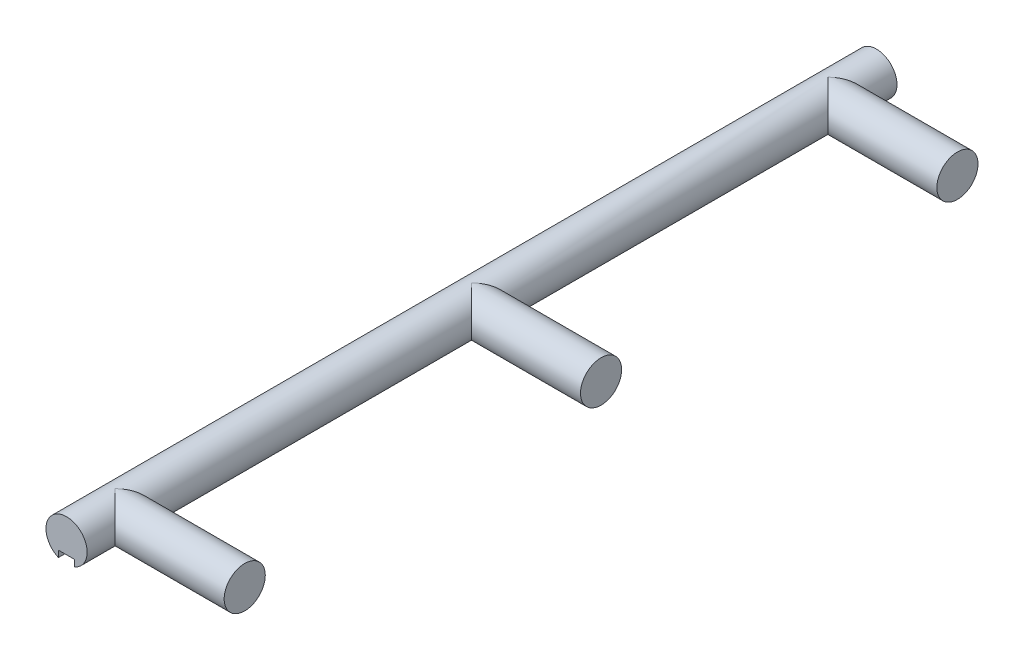
ISO-10303-21;
HEADER;
FILE_DESCRIPTION(('STEP AP214'),'2;1');
FILE_NAME('part.step','',(''),(''),'','','');
FILE_SCHEMA(('AUTOMOTIVE_DESIGN { 1 0 10303 214 1 1 1 1 }'));
ENDSEC;
DATA;
#1=APPLICATION_CONTEXT('core data for automotive mechanical design processes');
#2=APPLICATION_PROTOCOL_DEFINITION('international standard','automotive_design',2000,#1);
#3=PRODUCT_CONTEXT('',#1,'mechanical');
#4=PRODUCT('Part','Part','',(#3));
#5=PRODUCT_RELATED_PRODUCT_CATEGORY('part','',(#4));
#6=PRODUCT_DEFINITION_FORMATION('','',#4);
#7=PRODUCT_DEFINITION_CONTEXT('part definition',#1,'design');
#8=PRODUCT_DEFINITION('design','',#6,#7);
#9=PRODUCT_DEFINITION_SHAPE('','',#8);
#10=(LENGTH_UNIT() NAMED_UNIT(*) SI_UNIT(.MILLI.,.METRE.));
#11=(NAMED_UNIT(*) PLANE_ANGLE_UNIT() SI_UNIT($,.RADIAN.));
#12=(NAMED_UNIT(*) SI_UNIT($,.STERADIAN.) SOLID_ANGLE_UNIT());
#13=UNCERTAINTY_MEASURE_WITH_UNIT(LENGTH_MEASURE(1.E-05),#10,'distance_accuracy_value','');
#14=(GEOMETRIC_REPRESENTATION_CONTEXT(3) GLOBAL_UNCERTAINTY_ASSIGNED_CONTEXT((#13)) GLOBAL_UNIT_ASSIGNED_CONTEXT((#10,
#11,#12)) REPRESENTATION_CONTEXT('',''));
#15=CARTESIAN_POINT('',(0.,0.,0.));
#16=DIRECTION('',(0.,0.,1.));
#17=DIRECTION('',(1.,0.,0.));
#18=AXIS2_PLACEMENT_3D('',#15,#16,#17);
#19=CARTESIAN_POINT('',(0.,0.,125.));
#20=DIRECTION('',(0.,0.,-1.));
#21=DIRECTION('',(-1.,0.,0.));
#22=AXIS2_PLACEMENT_3D('',#19,#20,#21);
#23=CYLINDRICAL_SURFACE('',#22,6.35);
#24=CARTESIAN_POINT('',(0.,0.,-110.));
#25=DIRECTION('',(-0.707106781186547,0.,-0.707106781186547));
#26=DIRECTION('',(0.707106781186547,0.,-0.707106781186547));
#27=AXIS2_PLACEMENT_3D('',#24,#25,#26);
#28=ELLIPSE('',#27,8.98025612106915,6.35);
#29=CARTESIAN_POINT('',(0.,-6.35,-110.));
#30=VERTEX_POINT('',#29);
#31=CARTESIAN_POINT('',(0.,6.35,-110.));
#32=VERTEX_POINT('',#31);
#33=EDGE_CURVE('E153',#30,#32,#28,.F.);
#34=ORIENTED_EDGE('',*,*,#33,.F.);
#35=CARTESIAN_POINT('',(0.,0.,-110.));
#36=DIRECTION('',(0.707106781186547,0.,-0.707106781186547));
#37=DIRECTION('',(-0.707106781186547,0.,-0.707106781186547));
#38=AXIS2_PLACEMENT_3D('',#35,#36,#37);
#39=ELLIPSE('',#38,8.98025612106915,6.35);
#40=EDGE_CURVE('E150',#32,#30,#39,.T.);
#41=ORIENTED_EDGE('',*,*,#40,.F.);
#42=EDGE_LOOP('',(#34,#41));
#43=FACE_BOUND('',#42,.T.);
#44=CARTESIAN_POINT('',(0.,0.,-125.));
#45=DIRECTION('',(0.,0.,1.));
#46=DIRECTION('',(1.,0.,0.));
#47=AXIS2_PLACEMENT_3D('',#44,#45,#46);
#48=CIRCLE('',#47,6.35);
#49=CARTESIAN_POINT('',(6.35,0.,-125.));
#50=VERTEX_POINT('',#49);
#51=EDGE_CURVE('E138',#50,#50,#48,.T.);
#52=ORIENTED_EDGE('',*,*,#51,.T.);
#53=EDGE_LOOP('',(#52));
#54=FACE_BOUND('',#53,.T.);
#55=CARTESIAN_POINT('',(0.,0.,0.));
#56=DIRECTION('',(-0.707106781186547,0.,-0.707106781186547));
#57=DIRECTION('',(0.707106781186547,0.,-0.707106781186547));
#58=AXIS2_PLACEMENT_3D('',#55,#56,#57);
#59=ELLIPSE('',#58,8.98025612106915,6.35);
#60=CARTESIAN_POINT('',(0.,-6.35,0.));
#61=VERTEX_POINT('',#60);
#62=CARTESIAN_POINT('',(0.,6.35,0.));
#63=VERTEX_POINT('',#62);
#64=EDGE_CURVE('E147',#61,#63,#59,.F.);
#65=ORIENTED_EDGE('',*,*,#64,.F.);
#66=CARTESIAN_POINT('',(0.,0.,0.));
#67=DIRECTION('',(0.707106781186547,0.,-0.707106781186547));
#68=DIRECTION('',(-0.707106781186547,0.,-0.707106781186547));
#69=AXIS2_PLACEMENT_3D('',#66,#67,#68);
#70=ELLIPSE('',#69,8.98025612106915,6.35);
#71=EDGE_CURVE('E142',#63,#61,#70,.T.);
#72=ORIENTED_EDGE('',*,*,#71,.F.);
#73=EDGE_LOOP('',(#65,#72));
#74=FACE_BOUND('',#73,.T.);
#75=CARTESIAN_POINT('',(0.,0.,125.));
#76=DIRECTION('',(0.,0.,1.));
#77=DIRECTION('',(1.,0.,0.));
#78=AXIS2_PLACEMENT_3D('',#75,#76,#77);
#79=CIRCLE('',#78,6.35);
#80=CARTESIAN_POINT('',(2.5,-5.83716540796986,125.));
#81=VERTEX_POINT('',#80);
#82=CARTESIAN_POINT('',(-2.5,-5.83716540796987,125.));
#83=VERTEX_POINT('',#82);
#84=EDGE_CURVE('E139',#81,#83,#79,.T.);
#85=ORIENTED_EDGE('',*,*,#84,.F.);
#86=DIRECTION('',(0.,0.,-1.));
#87=VECTOR('',#86,1.);
#88=CARTESIAN_POINT('',(2.5,-5.83716540796986,125.));
#89=LINE('',#88,#87);
#90=CARTESIAN_POINT('',(2.5,-5.83716540797043,112.5));
#91=VERTEX_POINT('',#90);
#92=EDGE_CURVE('E125',#81,#91,#89,.T.);
#93=ORIENTED_EDGE('',*,*,#92,.T.);
#94=CARTESIAN_POINT('',(0.,-3.84062947272745E-13,110.));
#95=DIRECTION('',(0.707106781186547,0.,-0.707106781186547));
#96=DIRECTION('',(-0.707106781186547,0.,-0.707106781186547));
#97=AXIS2_PLACEMENT_3D('',#94,#95,#96);
#98=ELLIPSE('',#97,8.98025612106915,6.35);
#99=CARTESIAN_POINT('',(0.,6.35,110.));
#100=VERTEX_POINT('',#99);
#101=EDGE_CURVE('E156',#100,#91,#98,.T.);
#102=ORIENTED_EDGE('',*,*,#101,.F.);
#103=CARTESIAN_POINT('',(0.,-3.84062947272745E-13,110.));
#104=DIRECTION('',(-0.707106781186547,0.,-0.707106781186547));
#105=DIRECTION('',(0.707106781186547,0.,-0.707106781186547));
#106=AXIS2_PLACEMENT_3D('',#103,#104,#105);
#107=ELLIPSE('',#106,8.98025612106915,6.35);
#108=CARTESIAN_POINT('',(2.5,-5.83716540797043,107.5));
#109=VERTEX_POINT('',#108);
#110=EDGE_CURVE('E54',#109,#100,#107,.F.);
#111=ORIENTED_EDGE('',*,*,#110,.F.);
#112=CARTESIAN_POINT('',(2.5,-5.83716540796986,105.));
#113=VERTEX_POINT('',#112);
#114=EDGE_CURVE('E47',#109,#113,#89,.T.);
#115=ORIENTED_EDGE('',*,*,#114,.T.);
#116=CARTESIAN_POINT('',(0.,0.,105.));
#117=DIRECTION('',(0.,0.,1.));
#118=DIRECTION('',(1.,0.,0.));
#119=AXIS2_PLACEMENT_3D('',#116,#117,#118);
#120=CIRCLE('',#119,6.35);
#121=CARTESIAN_POINT('',(-2.5,-5.83716540796987,105.));
#122=VERTEX_POINT('',#121);
#123=EDGE_CURVE('E11',#122,#113,#120,.T.);
#124=ORIENTED_EDGE('',*,*,#123,.F.);
#125=DIRECTION('',(0.,0.,-1.));
#126=VECTOR('',#125,1.);
#127=CARTESIAN_POINT('',(-2.5,-5.83716540796987,125.));
#128=LINE('',#127,#126);
#129=EDGE_CURVE('E126',#122,#83,#128,.F.);
#130=ORIENTED_EDGE('',*,*,#129,.T.);
#131=EDGE_LOOP('',(#85,#93,#102,#111,#115,#124,#130));
#132=FACE_BOUND('',#131,.T.);
#133=ADVANCED_FACE('F33',(#43,#54,#74,#132),#23,.T.);
#134=CARTESIAN_POINT('',(0.,0.,125.));
#135=DIRECTION('',(0.,0.,1.));
#136=DIRECTION('',(1.,0.,0.));
#137=AXIS2_PLACEMENT_3D('',#134,#135,#136);
#138=PLANE('',#137);
#139=DIRECTION('',(0.,-1.,0.));
#140=VECTOR('',#139,1.);
#141=CARTESIAN_POINT('',(-2.5,-8.85,125.));
#142=LINE('',#141,#140);
#143=CARTESIAN_POINT('',(-2.5,-3.85,125.));
#144=VERTEX_POINT('',#143);
#145=EDGE_CURVE('E118',#144,#83,#142,.T.);
#146=ORIENTED_EDGE('',*,*,#145,.F.);
#147=DIRECTION('',(-1.,0.,0.));
#148=VECTOR('',#147,1.);
#149=CARTESIAN_POINT('',(2.5,-3.85,125.));
#150=LINE('',#149,#148);
#151=CARTESIAN_POINT('',(2.5,-3.85,125.));
#152=VERTEX_POINT('',#151);
#153=EDGE_CURVE('E121',#152,#144,#150,.T.);
#154=ORIENTED_EDGE('',*,*,#153,.F.);
#155=DIRECTION('',(0.,1.,0.));
#156=VECTOR('',#155,1.);
#157=CARTESIAN_POINT('',(2.5,-8.85,125.));
#158=LINE('',#157,#156);
#159=EDGE_CURVE('E107',#81,#152,#158,.T.);
#160=ORIENTED_EDGE('',*,*,#159,.F.);
#161=ORIENTED_EDGE('',*,*,#84,.T.);
#162=EDGE_LOOP('',(#146,#154,#160,#161));
#163=FACE_BOUND('',#162,.T.);
#164=ADVANCED_FACE('F164',(#163),#138,.T.);
#165=CARTESIAN_POINT('',(0.,0.,-125.));
#166=DIRECTION('',(0.,0.,1.));
#167=DIRECTION('',(1.,0.,0.));
#168=AXIS2_PLACEMENT_3D('',#165,#166,#167);
#169=PLANE('',#168);
#170=ORIENTED_EDGE('',*,*,#51,.F.);
#171=EDGE_LOOP('',(#170));
#172=FACE_BOUND('',#171,.T.);
#173=ADVANCED_FACE('F182',(#172),#169,.F.);
#174=CARTESIAN_POINT('',(40.,0.,0.));
#175=DIRECTION('',(-1.,0.,0.));
#176=DIRECTION('',(0.,0.,1.));
#177=AXIS2_PLACEMENT_3D('',#174,#175,#176);
#178=CYLINDRICAL_SURFACE('',#177,6.35);
#179=CARTESIAN_POINT('',(40.,0.,0.));
#180=DIRECTION('',(1.,0.,0.));
#181=DIRECTION('',(0.,0.,-1.));
#182=AXIS2_PLACEMENT_3D('',#179,#180,#181);
#183=CIRCLE('',#182,6.35);
#184=CARTESIAN_POINT('',(40.,0.,-6.35));
#185=VERTEX_POINT('',#184);
#186=EDGE_CURVE('E135',#185,#185,#183,.T.);
#187=ORIENTED_EDGE('',*,*,#186,.F.);
#188=EDGE_LOOP('',(#187));
#189=FACE_BOUND('',#188,.T.);
#190=ORIENTED_EDGE('',*,*,#71,.T.);
#191=ORIENTED_EDGE('',*,*,#64,.T.);
#192=EDGE_LOOP('',(#190,#191));
#193=FACE_BOUND('',#192,.T.);
#194=ADVANCED_FACE('F188',(#189,#193),#178,.T.);
#195=CARTESIAN_POINT('',(40.,0.,0.));
#196=DIRECTION('',(1.,0.,0.));
#197=DIRECTION('',(0.,0.,-1.));
#198=AXIS2_PLACEMENT_3D('',#195,#196,#197);
#199=PLANE('',#198);
#200=ORIENTED_EDGE('',*,*,#186,.T.);
#201=EDGE_LOOP('',(#200));
#202=FACE_BOUND('',#201,.T.);
#203=ADVANCED_FACE('F190',(#202),#199,.T.);
#204=CARTESIAN_POINT('',(40.,0.,-110.));
#205=DIRECTION('',(-1.,0.,0.));
#206=DIRECTION('',(0.,0.,1.));
#207=AXIS2_PLACEMENT_3D('',#204,#205,#206);
#208=CYLINDRICAL_SURFACE('',#207,6.35);
#209=CARTESIAN_POINT('',(40.,0.,-110.));
#210=DIRECTION('',(1.,0.,0.));
#211=DIRECTION('',(0.,0.,-1.));
#212=AXIS2_PLACEMENT_3D('',#209,#210,#211);
#213=CIRCLE('',#212,6.35);
#214=CARTESIAN_POINT('',(40.,0.,-116.35));
#215=VERTEX_POINT('',#214);
#216=EDGE_CURVE('E132',#215,#215,#213,.T.);
#217=ORIENTED_EDGE('',*,*,#216,.F.);
#218=EDGE_LOOP('',(#217));
#219=FACE_BOUND('',#218,.T.);
#220=ORIENTED_EDGE('',*,*,#40,.T.);
#221=ORIENTED_EDGE('',*,*,#33,.T.);
#222=EDGE_LOOP('',(#220,#221));
#223=FACE_BOUND('',#222,.T.);
#224=ADVANCED_FACE('F197',(#219,#223),#208,.T.);
#225=CARTESIAN_POINT('',(40.,0.,-110.));
#226=DIRECTION('',(1.,0.,0.));
#227=DIRECTION('',(0.,0.,-1.));
#228=AXIS2_PLACEMENT_3D('',#225,#226,#227);
#229=PLANE('',#228);
#230=ORIENTED_EDGE('',*,*,#216,.T.);
#231=EDGE_LOOP('',(#230));
#232=FACE_BOUND('',#231,.T.);
#233=ADVANCED_FACE('F205',(#232),#229,.T.);
#234=CARTESIAN_POINT('',(40.,-7.68125894545489E-13,110.));
#235=DIRECTION('',(-1.,0.,0.));
#236=DIRECTION('',(0.,0.,1.));
#237=AXIS2_PLACEMENT_3D('',#234,#235,#236);
#238=CYLINDRICAL_SURFACE('',#237,6.35);
#239=CARTESIAN_POINT('',(40.,-7.68125894545489E-13,110.));
#240=DIRECTION('',(1.,0.,0.));
#241=DIRECTION('',(0.,0.,-1.));
#242=AXIS2_PLACEMENT_3D('',#239,#240,#241);
#243=CIRCLE('',#242,6.35);
#244=CARTESIAN_POINT('',(40.,-7.68125894545489E-13,103.65));
#245=VERTEX_POINT('',#244);
#246=EDGE_CURVE('E129',#245,#245,#243,.T.);
#247=ORIENTED_EDGE('',*,*,#246,.F.);
#248=EDGE_LOOP('',(#247));
#249=FACE_BOUND('',#248,.T.);
#250=ORIENTED_EDGE('',*,*,#101,.T.);
#251=CARTESIAN_POINT('',(2.5,-7.68125894545489E-13,110.));
#252=DIRECTION('',(1.,0.,0.));
#253=DIRECTION('',(0.,0.,-1.));
#254=AXIS2_PLACEMENT_3D('',#251,#252,#253);
#255=CIRCLE('',#254,6.35);
#256=EDGE_CURVE('E40',#91,#109,#255,.T.);
#257=ORIENTED_EDGE('',*,*,#256,.T.);
#258=ORIENTED_EDGE('',*,*,#110,.T.);
#259=EDGE_LOOP('',(#250,#257,#258));
#260=FACE_BOUND('',#259,.T.);
#261=ADVANCED_FACE('F158',(#249,#260),#238,.T.);
#262=CARTESIAN_POINT('',(40.,-7.68125894545489E-13,110.));
#263=DIRECTION('',(1.,0.,0.));
#264=DIRECTION('',(0.,0.,-1.));
#265=AXIS2_PLACEMENT_3D('',#262,#263,#264);
#266=PLANE('',#265);
#267=ORIENTED_EDGE('',*,*,#246,.T.);
#268=EDGE_LOOP('',(#267));
#269=FACE_BOUND('',#268,.T.);
#270=ADVANCED_FACE('F174',(#269),#266,.T.);
#271=CARTESIAN_POINT('',(0.,0.,105.));
#272=DIRECTION('',(0.,0.,1.));
#273=DIRECTION('',(1.,0.,0.));
#274=AXIS2_PLACEMENT_3D('',#271,#272,#273);
#275=PLANE('',#274);
#276=ORIENTED_EDGE('',*,*,#123,.T.);
#277=DIRECTION('',(0.,1.,0.));
#278=VECTOR('',#277,1.);
#279=CARTESIAN_POINT('',(2.5,-8.85,105.));
#280=LINE('',#279,#278);
#281=CARTESIAN_POINT('',(2.5,-3.85,105.));
#282=VERTEX_POINT('',#281);
#283=EDGE_CURVE('E94',#113,#282,#280,.T.);
#284=ORIENTED_EDGE('',*,*,#283,.T.);
#285=DIRECTION('',(-1.,0.,0.));
#286=VECTOR('',#285,1.);
#287=CARTESIAN_POINT('',(2.5,-3.85,105.));
#288=LINE('',#287,#286);
#289=CARTESIAN_POINT('',(-2.5,-3.85,105.));
#290=VERTEX_POINT('',#289);
#291=EDGE_CURVE('E99',#282,#290,#288,.T.);
#292=ORIENTED_EDGE('',*,*,#291,.T.);
#293=DIRECTION('',(0.,-1.,0.));
#294=VECTOR('',#293,1.);
#295=CARTESIAN_POINT('',(-2.5,-8.85,105.));
#296=LINE('',#295,#294);
#297=EDGE_CURVE('E101',#290,#122,#296,.T.);
#298=ORIENTED_EDGE('',*,*,#297,.T.);
#299=EDGE_LOOP('',(#276,#284,#292,#298));
#300=FACE_BOUND('',#299,.T.);
#301=ADVANCED_FACE('F96',(#300),#275,.T.);
#302=CARTESIAN_POINT('',(-2.5,-8.85,105.));
#303=DIRECTION('',(-1.,0.,0.));
#304=DIRECTION('',(0.,0.,1.));
#305=AXIS2_PLACEMENT_3D('',#302,#303,#304);
#306=PLANE('',#305);
#307=ORIENTED_EDGE('',*,*,#297,.F.);
#308=DIRECTION('',(0.,0.,1.));
#309=VECTOR('',#308,1.);
#310=CARTESIAN_POINT('',(-2.5,-3.85,105.));
#311=LINE('',#310,#309);
#312=EDGE_CURVE('E111',#290,#144,#311,.T.);
#313=ORIENTED_EDGE('',*,*,#312,.T.);
#314=ORIENTED_EDGE('',*,*,#145,.T.);
#315=ORIENTED_EDGE('',*,*,#129,.F.);
#316=EDGE_LOOP('',(#307,#313,#314,#315));
#317=FACE_BOUND('',#316,.T.);
#318=ADVANCED_FACE('F166',(#317),#306,.F.);
#319=CARTESIAN_POINT('',(2.5,-8.85,105.));
#320=DIRECTION('',(1.,0.,0.));
#321=DIRECTION('',(0.,0.,-1.));
#322=AXIS2_PLACEMENT_3D('',#319,#320,#321);
#323=PLANE('',#322);
#324=ORIENTED_EDGE('',*,*,#159,.T.);
#325=DIRECTION('',(0.,0.,1.));
#326=VECTOR('',#325,1.);
#327=CARTESIAN_POINT('',(2.5,-3.85,105.));
#328=LINE('',#327,#326);
#329=EDGE_CURVE('E104',#282,#152,#328,.T.);
#330=ORIENTED_EDGE('',*,*,#329,.F.);
#331=ORIENTED_EDGE('',*,*,#283,.F.);
#332=ORIENTED_EDGE('',*,*,#114,.F.);
#333=ORIENTED_EDGE('',*,*,#256,.F.);
#334=ORIENTED_EDGE('',*,*,#92,.F.);
#335=EDGE_LOOP('',(#324,#330,#331,#332,#333,#334));
#336=FACE_BOUND('',#335,.T.);
#337=ADVANCED_FACE('F105',(#336),#323,.F.);
#338=CARTESIAN_POINT('',(2.5,-3.85,105.));
#339=DIRECTION('',(0.,1.,0.));
#340=DIRECTION('',(-1.,0.,0.));
#341=AXIS2_PLACEMENT_3D('',#338,#339,#340);
#342=PLANE('',#341);
#343=ORIENTED_EDGE('',*,*,#153,.T.);
#344=ORIENTED_EDGE('',*,*,#312,.F.);
#345=ORIENTED_EDGE('',*,*,#291,.F.);
#346=ORIENTED_EDGE('',*,*,#329,.T.);
#347=EDGE_LOOP('',(#343,#344,#345,#346));
#348=FACE_BOUND('',#347,.T.);
#349=ADVANCED_FACE('F113',(#348),#342,.F.);
#350=CLOSED_SHELL('',(#133,#164,#173,#194,#203,#224,#233,#261,#270,#301,#318,#337,#349));
#351=MANIFOLD_SOLID_BREP('B2',#350);
#352=ADVANCED_BREP_SHAPE_REPRESENTATION('',(#18,#351),#14);
#353=SHAPE_DEFINITION_REPRESENTATION(#9,#352);
ENDSEC;
END-ISO-10303-21;
